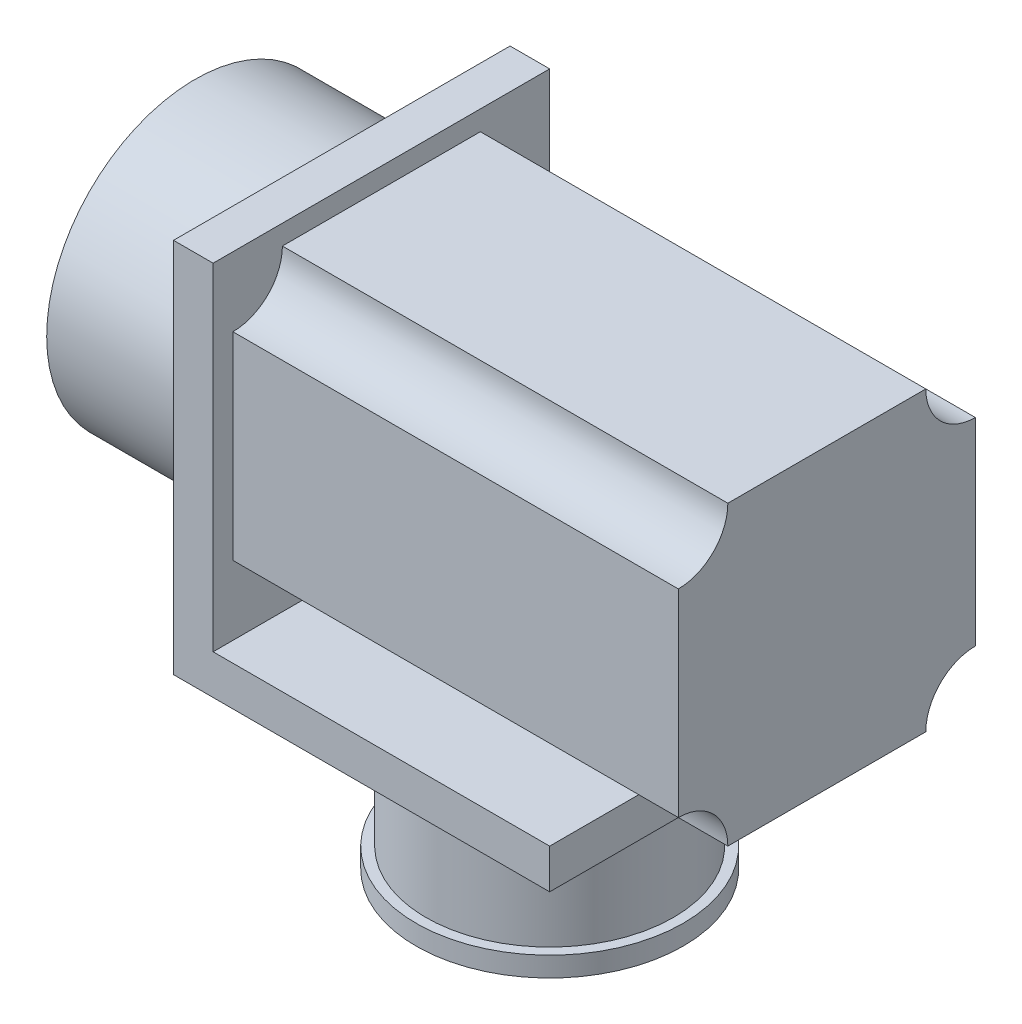
ISO-10303-21;
HEADER;
FILE_DESCRIPTION(('STEP AP214'),'2;1');
FILE_NAME('part.step','',(''),(''),'','','');
FILE_SCHEMA(('AUTOMOTIVE_DESIGN { 1 0 10303 214 1 1 1 1 }'));
ENDSEC;
DATA;
#1=APPLICATION_CONTEXT('core data for automotive mechanical design processes');
#2=APPLICATION_PROTOCOL_DEFINITION('international standard','automotive_design',2000,#1);
#3=PRODUCT_CONTEXT('',#1,'mechanical');
#4=PRODUCT('Part','Part','',(#3));
#5=PRODUCT_RELATED_PRODUCT_CATEGORY('part','',(#4));
#6=PRODUCT_DEFINITION_FORMATION('','',#4);
#7=PRODUCT_DEFINITION_CONTEXT('part definition',#1,'design');
#8=PRODUCT_DEFINITION('design','',#6,#7);
#9=PRODUCT_DEFINITION_SHAPE('','',#8);
#10=(LENGTH_UNIT() NAMED_UNIT(*) SI_UNIT(.MILLI.,.METRE.));
#11=(NAMED_UNIT(*) PLANE_ANGLE_UNIT() SI_UNIT($,.RADIAN.));
#12=(NAMED_UNIT(*) SI_UNIT($,.STERADIAN.) SOLID_ANGLE_UNIT());
#13=UNCERTAINTY_MEASURE_WITH_UNIT(LENGTH_MEASURE(1.E-05),#10,'distance_accuracy_value','');
#14=(GEOMETRIC_REPRESENTATION_CONTEXT(3) GLOBAL_UNCERTAINTY_ASSIGNED_CONTEXT((#13)) GLOBAL_UNIT_ASSIGNED_CONTEXT((#10,
#11,#12)) REPRESENTATION_CONTEXT('',''));
#15=CARTESIAN_POINT('',(0.,0.,0.));
#16=DIRECTION('',(0.,0.,1.));
#17=DIRECTION('',(1.,0.,0.));
#18=AXIS2_PLACEMENT_3D('',#15,#16,#17);
#19=CARTESIAN_POINT('',(-115.398264295538,-54.7615495871551,-85.9384662301803));
#20=DIRECTION('',(1.,0.,0.));
#21=DIRECTION('',(0.,0.,-1.));
#22=AXIS2_PLACEMENT_3D('',#19,#20,#21);
#23=CYLINDRICAL_SURFACE('',#22,62.5);
#24=CARTESIAN_POINT('',(-115.398264295538,-54.7615495871551,-85.9384662301803));
#25=DIRECTION('',(-1.,0.,0.));
#26=DIRECTION('',(0.,0.,1.));
#27=AXIS2_PLACEMENT_3D('',#24,#25,#26);
#28=CIRCLE('',#27,62.5);
#29=CARTESIAN_POINT('',(-115.398264295538,-54.7615495871551,-23.4384662301803));
#30=VERTEX_POINT('',#29);
#31=EDGE_CURVE('E179',#30,#30,#28,.T.);
#32=ORIENTED_EDGE('',*,*,#31,.T.);
#33=EDGE_LOOP('',(#32));
#34=FACE_BOUND('',#33,.T.);
#35=CARTESIAN_POINT('',(-50.3982642955381,-54.7615495871551,-85.9384662301803));
#36=DIRECTION('',(1.,0.,0.));
#37=DIRECTION('',(0.,0.,-1.));
#38=AXIS2_PLACEMENT_3D('',#35,#36,#37);
#39=CIRCLE('',#38,62.5);
#40=CARTESIAN_POINT('',(-50.3982642955381,-54.7615495871551,-148.43846623018));
#41=VERTEX_POINT('',#40);
#42=EDGE_CURVE('E39',#41,#41,#39,.T.);
#43=ORIENTED_EDGE('',*,*,#42,.T.);
#44=EDGE_LOOP('',(#43));
#45=FACE_BOUND('',#44,.T.);
#46=ADVANCED_FACE('F35',(#34,#45),#23,.F.);
#47=CARTESIAN_POINT('',(64.6017357044619,-234.761549587155,-85.));
#48=DIRECTION('',(0.,1.,0.));
#49=DIRECTION('',(-1.,0.,0.));
#50=AXIS2_PLACEMENT_3D('',#47,#48,#49);
#51=CYLINDRICAL_SURFACE('',#50,62.5);
#52=CARTESIAN_POINT('',(64.6017357044619,-159.761549587155,-85.));
#53=DIRECTION('',(0.,-1.,0.));
#54=DIRECTION('',(1.,0.,0.));
#55=AXIS2_PLACEMENT_3D('',#52,#53,#54);
#56=CIRCLE('',#55,62.5);
#57=CARTESIAN_POINT('',(127.101735704462,-159.761549587155,-85.));
#58=VERTEX_POINT('',#57);
#59=EDGE_CURVE('E44',#58,#58,#56,.T.);
#60=ORIENTED_EDGE('',*,*,#59,.T.);
#61=EDGE_LOOP('',(#60));
#62=FACE_BOUND('',#61,.T.);
#63=CARTESIAN_POINT('',(64.6017357044619,-224.761549587155,-85.));
#64=DIRECTION('',(0.,-1.,0.));
#65=DIRECTION('',(1.,0.,0.));
#66=AXIS2_PLACEMENT_3D('',#63,#64,#65);
#67=CIRCLE('',#66,62.5);
#68=CARTESIAN_POINT('',(127.101735704462,-224.761549587155,-85.));
#69=VERTEX_POINT('',#68);
#70=EDGE_CURVE('E11',#69,#69,#67,.T.);
#71=ORIENTED_EDGE('',*,*,#70,.F.);
#72=EDGE_LOOP('',(#71));
#73=FACE_BOUND('',#72,.T.);
#74=ADVANCED_FACE('F282',(#62,#73),#51,.T.);
#75=CARTESIAN_POINT('',(204.601735704462,-129.761549587155,-10.));
#76=DIRECTION('',(0.,1.,0.));
#77=DIRECTION('',(-1.,0.,0.));
#78=AXIS2_PLACEMENT_3D('',#75,#76,#77);
#79=PLANE('',#78);
#80=DIRECTION('',(1.,0.,0.));
#81=VECTOR('',#80,1.);
#82=CARTESIAN_POINT('',(-55.7536033548655,-129.761549587155,-135.));
#83=LINE('',#82,#81);
#84=CARTESIAN_POINT('',(-20.3982642955381,-129.761549587155,-135.));
#85=VERTEX_POINT('',#84);
#86=CARTESIAN_POINT('',(204.601735704462,-129.761549587155,-135.));
#87=VERTEX_POINT('',#86);
#88=EDGE_CURVE('E330',#85,#87,#83,.T.);
#89=ORIENTED_EDGE('',*,*,#88,.T.);
#90=DIRECTION('',(0.,0.,-1.));
#91=VECTOR('',#90,1.);
#92=CARTESIAN_POINT('',(204.601735704462,-129.761549587155,-10.));
#93=LINE('',#92,#91);
#94=CARTESIAN_POINT('',(204.601735704462,-129.761549587155,-35.));
#95=VERTEX_POINT('',#94);
#96=EDGE_CURVE('E163',#95,#87,#93,.T.);
#97=ORIENTED_EDGE('',*,*,#96,.F.);
#98=DIRECTION('',(1.,0.,0.));
#99=VECTOR('',#98,1.);
#100=CARTESIAN_POINT('',(-55.7536033548655,-129.761549587155,-35.));
#101=LINE('',#100,#99);
#102=CARTESIAN_POINT('',(-20.3982642955381,-129.761549587155,-35.));
#103=VERTEX_POINT('',#102);
#104=EDGE_CURVE('E142',#103,#95,#101,.T.);
#105=ORIENTED_EDGE('',*,*,#104,.F.);
#106=DIRECTION('',(0.,0.,-1.));
#107=VECTOR('',#106,1.);
#108=CARTESIAN_POINT('',(-20.3982642955381,-129.761549587155,-10.));
#109=LINE('',#108,#107);
#110=EDGE_CURVE('E181',#103,#85,#109,.T.);
#111=ORIENTED_EDGE('',*,*,#110,.T.);
#112=EDGE_LOOP('',(#89,#97,#105,#111));
#113=FACE_BOUND('',#112,.T.);
#114=ADVANCED_FACE('F288',(#113),#79,.F.);
#115=CARTESIAN_POINT('',(204.601735704462,20.2384504128449,-160.));
#116=DIRECTION('',(0.,0.,1.));
#117=DIRECTION('',(1.,0.,0.));
#118=AXIS2_PLACEMENT_3D('',#115,#116,#117);
#119=PLANE('',#118);
#120=DIRECTION('',(0.,1.,0.));
#121=VECTOR('',#120,1.);
#122=CARTESIAN_POINT('',(-20.3982642955381,20.2384504128448,-160.));
#123=LINE('',#122,#121);
#124=CARTESIAN_POINT('',(-20.3982642955381,-104.761549587155,-160.));
#125=VERTEX_POINT('',#124);
#126=CARTESIAN_POINT('',(-20.3982642955381,-4.76154958715517,-160.));
#127=VERTEX_POINT('',#126);
#128=EDGE_CURVE('E169',#125,#127,#123,.T.);
#129=ORIENTED_EDGE('',*,*,#128,.T.);
#130=DIRECTION('',(1.,0.,0.));
#131=VECTOR('',#130,1.);
#132=CARTESIAN_POINT('',(-55.7536033548655,-4.76154958715518,-160.));
#133=LINE('',#132,#131);
#134=CARTESIAN_POINT('',(204.601735704462,-4.76154958715514,-160.));
#135=VERTEX_POINT('',#134);
#136=EDGE_CURVE('E338',#127,#135,#133,.T.);
#137=ORIENTED_EDGE('',*,*,#136,.T.);
#138=DIRECTION('',(0.,1.,0.));
#139=VECTOR('',#138,1.);
#140=CARTESIAN_POINT('',(204.601735704462,20.2384504128449,-160.));
#141=LINE('',#140,#139);
#142=CARTESIAN_POINT('',(204.601735704462,-104.761549587155,-160.));
#143=VERTEX_POINT('',#142);
#144=EDGE_CURVE('E166',#143,#135,#141,.T.);
#145=ORIENTED_EDGE('',*,*,#144,.F.);
#146=DIRECTION('',(1.,0.,0.));
#147=VECTOR('',#146,1.);
#148=CARTESIAN_POINT('',(-55.7536033548655,-104.761549587155,-160.));
#149=LINE('',#148,#147);
#150=EDGE_CURVE('E59',#125,#143,#149,.T.);
#151=ORIENTED_EDGE('',*,*,#150,.F.);
#152=EDGE_LOOP('',(#129,#137,#145,#151));
#153=FACE_BOUND('',#152,.T.);
#154=ADVANCED_FACE('F277',(#153),#119,.F.);
#155=CARTESIAN_POINT('',(204.601735704462,0.,0.));
#156=DIRECTION('',(1.,0.,0.));
#157=DIRECTION('',(0.,1.,0.));
#158=AXIS2_PLACEMENT_3D('',#155,#156,#157);
#159=PLANE('',#158);
#160=CARTESIAN_POINT('',(204.601735704462,20.2384504128449,-160.));
#161=DIRECTION('',(1.,0.,0.));
#162=DIRECTION('',(0.,1.,0.));
#163=AXIS2_PLACEMENT_3D('',#160,#161,#162);
#164=CIRCLE('',#163,25.);
#165=CARTESIAN_POINT('',(204.601735704462,20.2384504128449,-135.));
#166=VERTEX_POINT('',#165);
#167=EDGE_CURVE('E335',#166,#135,#164,.T.);
#168=ORIENTED_EDGE('',*,*,#167,.F.);
#169=DIRECTION('',(0.,0.,1.));
#170=VECTOR('',#169,1.);
#171=CARTESIAN_POINT('',(204.601735704462,20.2384504128449,-10.));
#172=LINE('',#171,#170);
#173=CARTESIAN_POINT('',(204.601735704462,20.2384504128449,-35.));
#174=VERTEX_POINT('',#173);
#175=EDGE_CURVE('E177',#166,#174,#172,.T.);
#176=ORIENTED_EDGE('',*,*,#175,.T.);
#177=CARTESIAN_POINT('',(204.601735704462,20.2384504128449,-10.));
#178=DIRECTION('',(1.,0.,0.));
#179=DIRECTION('',(0.,1.,0.));
#180=AXIS2_PLACEMENT_3D('',#177,#178,#179);
#181=CIRCLE('',#180,25.);
#182=CARTESIAN_POINT('',(204.601735704462,-4.76154958715514,-10.));
#183=VERTEX_POINT('',#182);
#184=EDGE_CURVE('E162',#183,#174,#181,.T.);
#185=ORIENTED_EDGE('',*,*,#184,.F.);
#186=DIRECTION('',(0.,-1.,0.));
#187=VECTOR('',#186,1.);
#188=CARTESIAN_POINT('',(204.601735704462,20.2384504128449,-10.));
#189=LINE('',#188,#187);
#190=CARTESIAN_POINT('',(204.601735704462,-104.761549587155,-10.));
#191=VERTEX_POINT('',#190);
#192=EDGE_CURVE('E154',#183,#191,#189,.T.);
#193=ORIENTED_EDGE('',*,*,#192,.T.);
#194=CARTESIAN_POINT('',(204.601735704462,-129.761549587155,-10.));
#195=DIRECTION('',(1.,0.,0.));
#196=DIRECTION('',(0.,1.,0.));
#197=AXIS2_PLACEMENT_3D('',#194,#195,#196);
#198=CIRCLE('',#197,25.);
#199=EDGE_CURVE('E136',#95,#191,#198,.T.);
#200=ORIENTED_EDGE('',*,*,#199,.F.);
#201=ORIENTED_EDGE('',*,*,#96,.T.);
#202=CARTESIAN_POINT('',(204.601735704462,-129.761549587155,-160.));
#203=DIRECTION('',(1.,0.,0.));
#204=DIRECTION('',(0.,1.,0.));
#205=AXIS2_PLACEMENT_3D('',#202,#203,#204);
#206=CIRCLE('',#205,25.);
#207=EDGE_CURVE('E328',#87,#143,#206,.F.);
#208=ORIENTED_EDGE('',*,*,#207,.T.);
#209=ORIENTED_EDGE('',*,*,#144,.T.);
#210=EDGE_LOOP('',(#168,#176,#185,#193,#200,#201,#208,#209));
#211=FACE_BOUND('',#210,.T.);
#212=ADVANCED_FACE('F160',(#211),#159,.T.);
#213=CARTESIAN_POINT('',(-20.3982642955381,30.2384504128449,-170.));
#214=DIRECTION('',(1.,0.,0.));
#215=DIRECTION('',(0.,1.,0.));
#216=AXIS2_PLACEMENT_3D('',#213,#214,#215);
#217=PLANE('',#216);
#218=CARTESIAN_POINT('',(-20.3982642955381,-129.761549587155,-10.));
#219=DIRECTION('',(1.,0.,0.));
#220=DIRECTION('',(0.,1.,0.));
#221=AXIS2_PLACEMENT_3D('',#218,#219,#220);
#222=CIRCLE('',#221,25.);
#223=CARTESIAN_POINT('',(-20.3982642955381,-104.761549587155,-10.));
#224=VERTEX_POINT('',#223);
#225=EDGE_CURVE('E157',#224,#103,#222,.F.);
#226=ORIENTED_EDGE('',*,*,#225,.F.);
#227=DIRECTION('',(0.,-1.,0.));
#228=VECTOR('',#227,1.);
#229=CARTESIAN_POINT('',(-20.3982642955381,20.2384504128448,-10.));
#230=LINE('',#229,#228);
#231=CARTESIAN_POINT('',(-20.3982642955381,-4.76154958715518,-10.));
#232=VERTEX_POINT('',#231);
#233=EDGE_CURVE('E156',#232,#224,#230,.T.);
#234=ORIENTED_EDGE('',*,*,#233,.F.);
#235=CARTESIAN_POINT('',(-20.3982642955381,20.2384504128448,-10.));
#236=DIRECTION('',(1.,0.,0.));
#237=DIRECTION('',(0.,1.,0.));
#238=AXIS2_PLACEMENT_3D('',#235,#236,#237);
#239=CIRCLE('',#238,25.);
#240=CARTESIAN_POINT('',(-20.3982642955381,20.2384504128448,-35.));
#241=VERTEX_POINT('',#240);
#242=EDGE_CURVE('E172',#241,#232,#239,.F.);
#243=ORIENTED_EDGE('',*,*,#242,.F.);
#244=DIRECTION('',(0.,0.,1.));
#245=VECTOR('',#244,1.);
#246=CARTESIAN_POINT('',(-20.3982642955381,20.2384504128448,-10.));
#247=LINE('',#246,#245);
#248=CARTESIAN_POINT('',(-20.3982642955381,20.2384504128448,-135.));
#249=VERTEX_POINT('',#248);
#250=EDGE_CURVE('E164',#249,#241,#247,.T.);
#251=ORIENTED_EDGE('',*,*,#250,.F.);
#252=CARTESIAN_POINT('',(-20.3982642955381,20.2384504128448,-160.));
#253=DIRECTION('',(1.,0.,0.));
#254=DIRECTION('',(0.,1.,0.));
#255=AXIS2_PLACEMENT_3D('',#252,#253,#254);
#256=CIRCLE('',#255,25.);
#257=EDGE_CURVE('E331',#127,#249,#256,.F.);
#258=ORIENTED_EDGE('',*,*,#257,.F.);
#259=ORIENTED_EDGE('',*,*,#128,.F.);
#260=CARTESIAN_POINT('',(-20.3982642955381,-129.761549587155,-160.));
#261=DIRECTION('',(1.,0.,0.));
#262=DIRECTION('',(0.,1.,0.));
#263=AXIS2_PLACEMENT_3D('',#260,#261,#262);
#264=CIRCLE('',#263,25.);
#265=EDGE_CURVE('E147',#125,#85,#264,.T.);
#266=ORIENTED_EDGE('',*,*,#265,.T.);
#267=ORIENTED_EDGE('',*,*,#110,.F.);
#268=EDGE_LOOP('',(#226,#234,#243,#251,#258,#259,#266,#267));
#269=FACE_BOUND('',#268,.T.);
#270=DIRECTION('',(0.,1.,0.));
#271=VECTOR('',#270,1.);
#272=CARTESIAN_POINT('',(-20.3982642955381,30.2384504128449,0.));
#273=LINE('',#272,#271);
#274=CARTESIAN_POINT('',(-20.3982642955381,-139.761549587155,0.));
#275=VERTEX_POINT('',#274);
#276=CARTESIAN_POINT('',(-20.3982642955381,30.2384504128449,0.));
#277=VERTEX_POINT('',#276);
#278=EDGE_CURVE('E226',#275,#277,#273,.T.);
#279=ORIENTED_EDGE('',*,*,#278,.F.);
#280=DIRECTION('',(0.,0.,1.));
#281=VECTOR('',#280,1.);
#282=CARTESIAN_POINT('',(-20.3982642955381,-139.761549587155,-170.));
#283=LINE('',#282,#281);
#284=CARTESIAN_POINT('',(-20.3982642955381,-139.761549587155,-170.));
#285=VERTEX_POINT('',#284);
#286=EDGE_CURVE('E235',#285,#275,#283,.T.);
#287=ORIENTED_EDGE('',*,*,#286,.F.);
#288=DIRECTION('',(0.,1.,0.));
#289=VECTOR('',#288,1.);
#290=CARTESIAN_POINT('',(-20.3982642955381,30.2384504128449,-170.));
#291=LINE('',#290,#289);
#292=CARTESIAN_POINT('',(-20.3982642955381,30.2384504128449,-170.));
#293=VERTEX_POINT('',#292);
#294=EDGE_CURVE('E208',#285,#293,#291,.T.);
#295=ORIENTED_EDGE('',*,*,#294,.T.);
#296=DIRECTION('',(0.,0.,1.));
#297=VECTOR('',#296,1.);
#298=CARTESIAN_POINT('',(-20.3982642955381,30.2384504128449,-170.));
#299=LINE('',#298,#297);
#300=EDGE_CURVE('E233',#293,#277,#299,.T.);
#301=ORIENTED_EDGE('',*,*,#300,.T.);
#302=EDGE_LOOP('',(#279,#287,#295,#301));
#303=FACE_BOUND('',#302,.T.);
#304=ADVANCED_FACE('F267',(#269,#303),#217,.T.);
#305=CARTESIAN_POINT('',(-40.3982642955382,-159.761549587155,-170.));
#306=DIRECTION('',(-1.,0.,0.));
#307=DIRECTION('',(0.,0.,1.));
#308=AXIS2_PLACEMENT_3D('',#305,#306,#307);
#309=PLANE('',#308);
#310=CARTESIAN_POINT('',(-40.3982642955382,-54.7615495871551,-85.9384662301803));
#311=DIRECTION('',(-1.,0.,0.));
#312=DIRECTION('',(0.,0.,1.));
#313=AXIS2_PLACEMENT_3D('',#310,#311,#312);
#314=CIRCLE('',#313,75.);
#315=CARTESIAN_POINT('',(-40.3982642955382,-54.7615495871551,-10.9384662301803));
#316=VERTEX_POINT('',#315);
#317=EDGE_CURVE('E188',#316,#316,#314,.T.);
#318=ORIENTED_EDGE('',*,*,#317,.F.);
#319=EDGE_LOOP('',(#318));
#320=FACE_BOUND('',#319,.T.);
#321=DIRECTION('',(0.,-1.,0.));
#322=VECTOR('',#321,1.);
#323=CARTESIAN_POINT('',(-40.3982642955382,-159.761549587155,0.));
#324=LINE('',#323,#322);
#325=CARTESIAN_POINT('',(-40.3982642955382,30.2384504128449,0.));
#326=VERTEX_POINT('',#325);
#327=CARTESIAN_POINT('',(-40.3982642955382,-159.761549587155,0.));
#328=VERTEX_POINT('',#327);
#329=EDGE_CURVE('E192',#326,#328,#324,.T.);
#330=ORIENTED_EDGE('',*,*,#329,.F.);
#331=DIRECTION('',(0.,0.,1.));
#332=VECTOR('',#331,1.);
#333=CARTESIAN_POINT('',(-40.3982642955382,30.2384504128449,-170.));
#334=LINE('',#333,#332);
#335=CARTESIAN_POINT('',(-40.3982642955382,30.2384504128449,-170.));
#336=VERTEX_POINT('',#335);
#337=EDGE_CURVE('E231',#336,#326,#334,.T.);
#338=ORIENTED_EDGE('',*,*,#337,.F.);
#339=DIRECTION('',(0.,-1.,0.));
#340=VECTOR('',#339,1.);
#341=CARTESIAN_POINT('',(-40.3982642955382,-159.761549587155,-170.));
#342=LINE('',#341,#340);
#343=CARTESIAN_POINT('',(-40.3982642955382,-159.761549587155,-170.));
#344=VERTEX_POINT('',#343);
#345=EDGE_CURVE('E195',#336,#344,#342,.T.);
#346=ORIENTED_EDGE('',*,*,#345,.T.);
#347=DIRECTION('',(0.,0.,1.));
#348=VECTOR('',#347,1.);
#349=CARTESIAN_POINT('',(-40.3982642955382,-159.761549587155,-170.));
#350=LINE('',#349,#348);
#351=EDGE_CURVE('E214',#344,#328,#350,.T.);
#352=ORIENTED_EDGE('',*,*,#351,.T.);
#353=EDGE_LOOP('',(#330,#338,#346,#352));
#354=FACE_BOUND('',#353,.T.);
#355=ADVANCED_FACE('F37',(#320,#354),#309,.T.);
#356=CARTESIAN_POINT('',(-40.3982642955382,30.2384504128449,-170.));
#357=DIRECTION('',(0.,1.,0.));
#358=DIRECTION('',(0.,0.,1.));
#359=AXIS2_PLACEMENT_3D('',#356,#357,#358);
#360=PLANE('',#359);
#361=DIRECTION('',(-1.,0.,0.));
#362=VECTOR('',#361,1.);
#363=CARTESIAN_POINT('',(-40.3982642955382,30.2384504128449,0.));
#364=LINE('',#363,#362);
#365=EDGE_CURVE('E199',#277,#326,#364,.T.);
#366=ORIENTED_EDGE('',*,*,#365,.F.);
#367=ORIENTED_EDGE('',*,*,#300,.F.);
#368=DIRECTION('',(-1.,0.,0.));
#369=VECTOR('',#368,1.);
#370=CARTESIAN_POINT('',(-40.3982642955382,30.2384504128449,-170.));
#371=LINE('',#370,#369);
#372=EDGE_CURVE('E211',#293,#336,#371,.T.);
#373=ORIENTED_EDGE('',*,*,#372,.T.);
#374=ORIENTED_EDGE('',*,*,#337,.T.);
#375=EDGE_LOOP('',(#366,#367,#373,#374));
#376=FACE_BOUND('',#375,.T.);
#377=ADVANCED_FACE('F254',(#376),#360,.T.);
#378=CARTESIAN_POINT('',(-20.3982642955381,-139.761549587155,-170.));
#379=DIRECTION('',(0.,1.,0.));
#380=DIRECTION('',(0.,0.,1.));
#381=AXIS2_PLACEMENT_3D('',#378,#379,#380);
#382=PLANE('',#381);
#383=DIRECTION('',(-1.,0.,0.));
#384=VECTOR('',#383,1.);
#385=CARTESIAN_POINT('',(-20.3982642955381,-139.761549587155,0.));
#386=LINE('',#385,#384);
#387=CARTESIAN_POINT('',(149.601735704462,-139.761549587155,0.));
#388=VERTEX_POINT('',#387);
#389=EDGE_CURVE('E223',#388,#275,#386,.T.);
#390=ORIENTED_EDGE('',*,*,#389,.F.);
#391=DIRECTION('',(0.,0.,1.));
#392=VECTOR('',#391,1.);
#393=CARTESIAN_POINT('',(149.601735704462,-139.761549587155,-170.));
#394=LINE('',#393,#392);
#395=CARTESIAN_POINT('',(149.601735704462,-139.761549587155,-170.));
#396=VERTEX_POINT('',#395);
#397=EDGE_CURVE('E237',#396,#388,#394,.T.);
#398=ORIENTED_EDGE('',*,*,#397,.F.);
#399=DIRECTION('',(-1.,0.,0.));
#400=VECTOR('',#399,1.);
#401=CARTESIAN_POINT('',(-20.3982642955381,-139.761549587155,-170.));
#402=LINE('',#401,#400);
#403=EDGE_CURVE('E205',#396,#285,#402,.T.);
#404=ORIENTED_EDGE('',*,*,#403,.T.);
#405=ORIENTED_EDGE('',*,*,#286,.T.);
#406=EDGE_LOOP('',(#390,#398,#404,#405));
#407=FACE_BOUND('',#406,.T.);
#408=ADVANCED_FACE('F265',(#407),#382,.T.);
#409=CARTESIAN_POINT('',(149.601735704462,-139.761549587155,-170.));
#410=DIRECTION('',(1.,0.,0.));
#411=DIRECTION('',(0.,0.,-1.));
#412=AXIS2_PLACEMENT_3D('',#409,#410,#411);
#413=PLANE('',#412);
#414=DIRECTION('',(0.,1.,0.));
#415=VECTOR('',#414,1.);
#416=CARTESIAN_POINT('',(149.601735704462,-139.761549587155,0.));
#417=LINE('',#416,#415);
#418=CARTESIAN_POINT('',(149.601735704462,-159.761549587155,0.));
#419=VERTEX_POINT('',#418);
#420=EDGE_CURVE('E220',#419,#388,#417,.T.);
#421=ORIENTED_EDGE('',*,*,#420,.F.);
#422=DIRECTION('',(0.,0.,1.));
#423=VECTOR('',#422,1.);
#424=CARTESIAN_POINT('',(149.601735704462,-159.761549587155,-170.));
#425=LINE('',#424,#423);
#426=CARTESIAN_POINT('',(149.601735704462,-159.761549587155,-170.));
#427=VERTEX_POINT('',#426);
#428=EDGE_CURVE('E239',#427,#419,#425,.T.);
#429=ORIENTED_EDGE('',*,*,#428,.F.);
#430=DIRECTION('',(0.,1.,0.));
#431=VECTOR('',#430,1.);
#432=CARTESIAN_POINT('',(149.601735704462,-139.761549587155,-170.));
#433=LINE('',#432,#431);
#434=EDGE_CURVE('E202',#427,#396,#433,.T.);
#435=ORIENTED_EDGE('',*,*,#434,.T.);
#436=ORIENTED_EDGE('',*,*,#397,.T.);
#437=EDGE_LOOP('',(#421,#429,#435,#436));
#438=FACE_BOUND('',#437,.T.);
#439=ADVANCED_FACE('F262',(#438),#413,.T.);
#440=CARTESIAN_POINT('',(149.601735704462,-159.761549587155,-170.));
#441=DIRECTION('',(0.,-1.,0.));
#442=DIRECTION('',(1.,0.,0.));
#443=AXIS2_PLACEMENT_3D('',#440,#441,#442);
#444=PLANE('',#443);
#445=ORIENTED_EDGE('',*,*,#59,.F.);
#446=EDGE_LOOP('',(#445));
#447=FACE_BOUND('',#446,.T.);
#448=DIRECTION('',(1.,0.,0.));
#449=VECTOR('',#448,1.);
#450=CARTESIAN_POINT('',(149.601735704462,-159.761549587155,0.));
#451=LINE('',#450,#449);
#452=EDGE_CURVE('E217',#328,#419,#451,.T.);
#453=ORIENTED_EDGE('',*,*,#452,.F.);
#454=ORIENTED_EDGE('',*,*,#351,.F.);
#455=DIRECTION('',(1.,0.,0.));
#456=VECTOR('',#455,1.);
#457=CARTESIAN_POINT('',(149.601735704462,-159.761549587155,-170.));
#458=LINE('',#457,#456);
#459=EDGE_CURVE('E198',#344,#427,#458,.T.);
#460=ORIENTED_EDGE('',*,*,#459,.T.);
#461=ORIENTED_EDGE('',*,*,#428,.T.);
#462=EDGE_LOOP('',(#453,#454,#460,#461));
#463=FACE_BOUND('',#462,.T.);
#464=ADVANCED_FACE('F247',(#447,#463),#444,.T.);
#465=CARTESIAN_POINT('',(0.,0.,-170.));
#466=DIRECTION('',(0.,0.,-1.));
#467=DIRECTION('',(-1.,0.,0.));
#468=AXIS2_PLACEMENT_3D('',#465,#466,#467);
#469=PLANE('',#468);
#470=ORIENTED_EDGE('',*,*,#345,.F.);
#471=ORIENTED_EDGE('',*,*,#372,.F.);
#472=ORIENTED_EDGE('',*,*,#294,.F.);
#473=ORIENTED_EDGE('',*,*,#403,.F.);
#474=ORIENTED_EDGE('',*,*,#434,.F.);
#475=ORIENTED_EDGE('',*,*,#459,.F.);
#476=EDGE_LOOP('',(#470,#471,#472,#473,#474,#475));
#477=FACE_BOUND('',#476,.T.);
#478=ADVANCED_FACE('F257',(#477),#469,.T.);
#479=CARTESIAN_POINT('',(0.,0.,0.));
#480=DIRECTION('',(0.,0.,-1.));
#481=DIRECTION('',(-1.,0.,0.));
#482=AXIS2_PLACEMENT_3D('',#479,#480,#481);
#483=PLANE('',#482);
#484=ORIENTED_EDGE('',*,*,#329,.T.);
#485=ORIENTED_EDGE('',*,*,#452,.T.);
#486=ORIENTED_EDGE('',*,*,#420,.T.);
#487=ORIENTED_EDGE('',*,*,#389,.T.);
#488=ORIENTED_EDGE('',*,*,#278,.T.);
#489=ORIENTED_EDGE('',*,*,#365,.T.);
#490=EDGE_LOOP('',(#484,#485,#486,#487,#488,#489));
#491=FACE_BOUND('',#490,.T.);
#492=ADVANCED_FACE('F250',(#491),#483,.F.);
#493=CARTESIAN_POINT('',(-115.398264295538,-54.7615495871551,-85.9384662301803));
#494=DIRECTION('',(-1.,0.,0.));
#495=DIRECTION('',(0.,0.,1.));
#496=AXIS2_PLACEMENT_3D('',#493,#494,#495);
#497=PLANE('',#496);
#498=CARTESIAN_POINT('',(-115.398264295538,-54.7615495871551,-85.9384662301803));
#499=DIRECTION('',(-1.,0.,0.));
#500=DIRECTION('',(0.,0.,1.));
#501=AXIS2_PLACEMENT_3D('',#498,#499,#500);
#502=CIRCLE('',#501,75.);
#503=CARTESIAN_POINT('',(-115.398264295538,-54.7615495871551,-10.9384662301803));
#504=VERTEX_POINT('',#503);
#505=EDGE_CURVE('E189',#504,#504,#502,.T.);
#506=ORIENTED_EDGE('',*,*,#505,.T.);
#507=EDGE_LOOP('',(#506));
#508=FACE_BOUND('',#507,.T.);
#509=ORIENTED_EDGE('',*,*,#31,.F.);
#510=EDGE_LOOP('',(#509));
#511=FACE_BOUND('',#510,.T.);
#512=ADVANCED_FACE('F295',(#508,#511),#497,.T.);
#513=CARTESIAN_POINT('',(-115.398264295538,-54.7615495871551,-85.9384662301803));
#514=DIRECTION('',(1.,0.,0.));
#515=DIRECTION('',(0.,0.,-1.));
#516=AXIS2_PLACEMENT_3D('',#513,#514,#515);
#517=CYLINDRICAL_SURFACE('',#516,75.);
#518=ORIENTED_EDGE('',*,*,#505,.F.);
#519=EDGE_LOOP('',(#518));
#520=FACE_BOUND('',#519,.T.);
#521=ORIENTED_EDGE('',*,*,#317,.T.);
#522=EDGE_LOOP('',(#521));
#523=FACE_BOUND('',#522,.T.);
#524=ADVANCED_FACE('F298',(#520,#523),#517,.T.);
#525=CARTESIAN_POINT('',(204.601735704462,20.2384504128449,-10.));
#526=DIRECTION('',(0.,0.,-1.));
#527=DIRECTION('',(0.,1.,0.));
#528=AXIS2_PLACEMENT_3D('',#525,#526,#527);
#529=PLANE('',#528);
#530=ORIENTED_EDGE('',*,*,#233,.T.);
#531=DIRECTION('',(1.,0.,0.));
#532=VECTOR('',#531,1.);
#533=CARTESIAN_POINT('',(-55.7536033548655,-104.761549587155,-10.));
#534=LINE('',#533,#532);
#535=EDGE_CURVE('E139',#224,#191,#534,.T.);
#536=ORIENTED_EDGE('',*,*,#535,.T.);
#537=ORIENTED_EDGE('',*,*,#192,.F.);
#538=DIRECTION('',(1.,0.,0.));
#539=VECTOR('',#538,1.);
#540=CARTESIAN_POINT('',(-55.7536033548655,-4.76154958715518,-10.));
#541=LINE('',#540,#539);
#542=EDGE_CURVE('E344',#232,#183,#541,.T.);
#543=ORIENTED_EDGE('',*,*,#542,.F.);
#544=EDGE_LOOP('',(#530,#536,#537,#543));
#545=FACE_BOUND('',#544,.T.);
#546=ADVANCED_FACE('F152',(#545),#529,.F.);
#547=CARTESIAN_POINT('',(204.601735704462,20.2384504128449,-10.));
#548=DIRECTION('',(0.,-1.,0.));
#549=DIRECTION('',(1.,0.,0.));
#550=AXIS2_PLACEMENT_3D('',#547,#548,#549);
#551=PLANE('',#550);
#552=ORIENTED_EDGE('',*,*,#175,.F.);
#553=DIRECTION('',(1.,0.,0.));
#554=VECTOR('',#553,1.);
#555=CARTESIAN_POINT('',(-55.7536033548655,20.2384504128448,-135.));
#556=LINE('',#555,#554);
#557=EDGE_CURVE('E51',#249,#166,#556,.T.);
#558=ORIENTED_EDGE('',*,*,#557,.F.);
#559=ORIENTED_EDGE('',*,*,#250,.T.);
#560=DIRECTION('',(1.,0.,0.));
#561=VECTOR('',#560,1.);
#562=CARTESIAN_POINT('',(-55.7536033548655,20.2384504128448,-35.));
#563=LINE('',#562,#561);
#564=EDGE_CURVE('E345',#241,#174,#563,.T.);
#565=ORIENTED_EDGE('',*,*,#564,.T.);
#566=EDGE_LOOP('',(#552,#558,#559,#565));
#567=FACE_BOUND('',#566,.T.);
#568=ADVANCED_FACE('F361',(#567),#551,.F.);
#569=CARTESIAN_POINT('',(-55.7536033548655,20.2384504128448,-10.));
#570=DIRECTION('',(1.,0.,0.));
#571=DIRECTION('',(0.,1.,0.));
#572=AXIS2_PLACEMENT_3D('',#569,#570,#571);
#573=CYLINDRICAL_SURFACE('',#572,25.);
#574=ORIENTED_EDGE('',*,*,#242,.T.);
#575=ORIENTED_EDGE('',*,*,#542,.T.);
#576=ORIENTED_EDGE('',*,*,#184,.T.);
#577=ORIENTED_EDGE('',*,*,#564,.F.);
#578=EDGE_LOOP('',(#574,#575,#576,#577));
#579=FACE_BOUND('',#578,.T.);
#580=ADVANCED_FACE('F348',(#579),#573,.F.);
#581=CARTESIAN_POINT('',(-55.7536033548655,-129.761549587155,-10.));
#582=DIRECTION('',(1.,0.,0.));
#583=DIRECTION('',(0.,1.,0.));
#584=AXIS2_PLACEMENT_3D('',#581,#582,#583);
#585=CYLINDRICAL_SURFACE('',#584,25.);
#586=ORIENTED_EDGE('',*,*,#225,.T.);
#587=ORIENTED_EDGE('',*,*,#104,.T.);
#588=ORIENTED_EDGE('',*,*,#199,.T.);
#589=ORIENTED_EDGE('',*,*,#535,.F.);
#590=EDGE_LOOP('',(#586,#587,#588,#589));
#591=FACE_BOUND('',#590,.T.);
#592=ADVANCED_FACE('F138',(#591),#585,.F.);
#593=CARTESIAN_POINT('',(-55.7536033548655,-129.761549587155,-160.));
#594=DIRECTION('',(1.,0.,0.));
#595=DIRECTION('',(0.,1.,0.));
#596=AXIS2_PLACEMENT_3D('',#593,#594,#595);
#597=CYLINDRICAL_SURFACE('',#596,25.);
#598=ORIENTED_EDGE('',*,*,#150,.T.);
#599=ORIENTED_EDGE('',*,*,#207,.F.);
#600=ORIENTED_EDGE('',*,*,#88,.F.);
#601=ORIENTED_EDGE('',*,*,#265,.F.);
#602=EDGE_LOOP('',(#598,#599,#600,#601));
#603=FACE_BOUND('',#602,.T.);
#604=ADVANCED_FACE('F415',(#603),#597,.F.);
#605=CARTESIAN_POINT('',(-55.7536033548655,20.2384504128448,-160.));
#606=DIRECTION('',(1.,0.,0.));
#607=DIRECTION('',(0.,1.,0.));
#608=AXIS2_PLACEMENT_3D('',#605,#606,#607);
#609=CYLINDRICAL_SURFACE('',#608,25.);
#610=ORIENTED_EDGE('',*,*,#257,.T.);
#611=ORIENTED_EDGE('',*,*,#557,.T.);
#612=ORIENTED_EDGE('',*,*,#167,.T.);
#613=ORIENTED_EDGE('',*,*,#136,.F.);
#614=EDGE_LOOP('',(#610,#611,#612,#613));
#615=FACE_BOUND('',#614,.T.);
#616=ADVANCED_FACE('F358',(#615),#609,.F.);
#617=CARTESIAN_POINT('',(64.6017357044619,-224.761549587155,-85.));
#618=DIRECTION('',(0.,-1.,0.));
#619=DIRECTION('',(1.,0.,0.));
#620=AXIS2_PLACEMENT_3D('',#617,#618,#619);
#621=CYLINDRICAL_SURFACE('',#620,67.5);
#622=CARTESIAN_POINT('',(64.6017357044619,-224.761549587155,-85.));
#623=DIRECTION('',(0.,-1.,0.));
#624=DIRECTION('',(1.,0.,0.));
#625=AXIS2_PLACEMENT_3D('',#622,#623,#624);
#626=CIRCLE('',#625,67.5);
#627=CARTESIAN_POINT('',(132.101735704462,-224.761549587155,-85.));
#628=VERTEX_POINT('',#627);
#629=EDGE_CURVE('E337',#628,#628,#626,.T.);
#630=ORIENTED_EDGE('',*,*,#629,.T.);
#631=EDGE_LOOP('',(#630));
#632=FACE_BOUND('',#631,.T.);
#633=CARTESIAN_POINT('',(64.6017357044619,-234.761549587155,-85.));
#634=DIRECTION('',(0.,-1.,0.));
#635=DIRECTION('',(1.,0.,0.));
#636=AXIS2_PLACEMENT_3D('',#633,#634,#635);
#637=CIRCLE('',#636,67.5);
#638=CARTESIAN_POINT('',(132.101735704462,-234.761549587155,-85.));
#639=VERTEX_POINT('',#638);
#640=EDGE_CURVE('E322',#639,#639,#637,.T.);
#641=ORIENTED_EDGE('',*,*,#640,.F.);
#642=EDGE_LOOP('',(#641));
#643=FACE_BOUND('',#642,.T.);
#644=ADVANCED_FACE('F431',(#632,#643),#621,.T.);
#645=CARTESIAN_POINT('',(64.6017357044619,-224.761549587155,-85.));
#646=DIRECTION('',(0.,-1.,0.));
#647=DIRECTION('',(1.,0.,0.));
#648=AXIS2_PLACEMENT_3D('',#645,#646,#647);
#649=PLANE('',#648);
#650=ORIENTED_EDGE('',*,*,#70,.T.);
#651=EDGE_LOOP('',(#650));
#652=FACE_BOUND('',#651,.T.);
#653=ORIENTED_EDGE('',*,*,#629,.F.);
#654=EDGE_LOOP('',(#653));
#655=FACE_BOUND('',#654,.T.);
#656=ADVANCED_FACE('F452',(#652,#655),#649,.F.);
#657=CARTESIAN_POINT('',(64.6017357044619,-234.761549587155,-85.));
#658=DIRECTION('',(0.,-1.,0.));
#659=DIRECTION('',(1.,0.,0.));
#660=AXIS2_PLACEMENT_3D('',#657,#658,#659);
#661=PLANE('',#660);
#662=ORIENTED_EDGE('',*,*,#640,.T.);
#663=EDGE_LOOP('',(#662));
#664=FACE_BOUND('',#663,.T.);
#665=ADVANCED_FACE('F462',(#664),#661,.T.);
#666=CARTESIAN_POINT('',(-50.3982642955382,-54.7615495871551,-18.4384662301803));
#667=DIRECTION('',(1.,0.,0.));
#668=DIRECTION('',(0.,0.,-1.));
#669=AXIS2_PLACEMENT_3D('',#666,#667,#668);
#670=PLANE('',#669);
#671=ORIENTED_EDGE('',*,*,#42,.F.);
#672=EDGE_LOOP('',(#671));
#673=FACE_BOUND('',#672,.T.);
#674=CARTESIAN_POINT('',(-50.3982642955382,-54.7615495871551,-85.9384662301803));
#675=DIRECTION('',(-1.,0.,0.));
#676=DIRECTION('',(0.,0.,1.));
#677=AXIS2_PLACEMENT_3D('',#674,#675,#676);
#678=CIRCLE('',#677,67.5);
#679=CARTESIAN_POINT('',(-50.3982642955382,-54.7615495871551,-18.4384662301803));
#680=VERTEX_POINT('',#679);
#681=EDGE_CURVE('E558',#680,#680,#678,.T.);
#682=ORIENTED_EDGE('',*,*,#681,.F.);
#683=EDGE_LOOP('',(#682));
#684=FACE_BOUND('',#683,.T.);
#685=ADVANCED_FACE('F471',(#673,#684),#670,.T.);
#686=CARTESIAN_POINT('',(-115.398264295538,-54.7615495871551,-85.9384662301803));
#687=DIRECTION('',(-1.,0.,0.));
#688=DIRECTION('',(0.,0.,1.));
#689=AXIS2_PLACEMENT_3D('',#686,#687,#688);
#690=CYLINDRICAL_SURFACE('',#689,67.5);
#691=ORIENTED_EDGE('',*,*,#681,.T.);
#692=EDGE_LOOP('',(#691));
#693=FACE_BOUND('',#692,.T.);
#694=CARTESIAN_POINT('',(-40.3982642955382,-54.7615495871551,-85.9384662301803));
#695=DIRECTION('',(-1.,0.,0.));
#696=DIRECTION('',(0.,0.,1.));
#697=AXIS2_PLACEMENT_3D('',#694,#695,#696);
#698=CIRCLE('',#697,67.5);
#699=CARTESIAN_POINT('',(-40.3982642955382,-54.7615495871551,-18.4384662301803));
#700=VERTEX_POINT('',#699);
#701=EDGE_CURVE('E556',#700,#700,#698,.T.);
#702=ORIENTED_EDGE('',*,*,#701,.F.);
#703=EDGE_LOOP('',(#702));
#704=FACE_BOUND('',#703,.T.);
#705=ADVANCED_FACE('F486',(#693,#704),#690,.F.);
#706=ORIENTED_EDGE('',*,*,#701,.T.);
#707=EDGE_LOOP('',(#706));
#708=FACE_BOUND('',#707,.T.);
#709=ADVANCED_FACE('F276',(#708),#309,.T.);
#710=CLOSED_SHELL('',(#46,#74,#114,#154,#212,#304,#355,#377,#408,#439,#464,#478,#492,#512,#524,
#546,#568,#580,#592,#604,#616,#644,#656,#665,#685,#705,#709));
#711=MANIFOLD_SOLID_BREP('B2',#710);
#712=ADVANCED_BREP_SHAPE_REPRESENTATION('',(#18,#711),#14);
#713=SHAPE_DEFINITION_REPRESENTATION(#9,#712);
ENDSEC;
END-ISO-10303-21;
